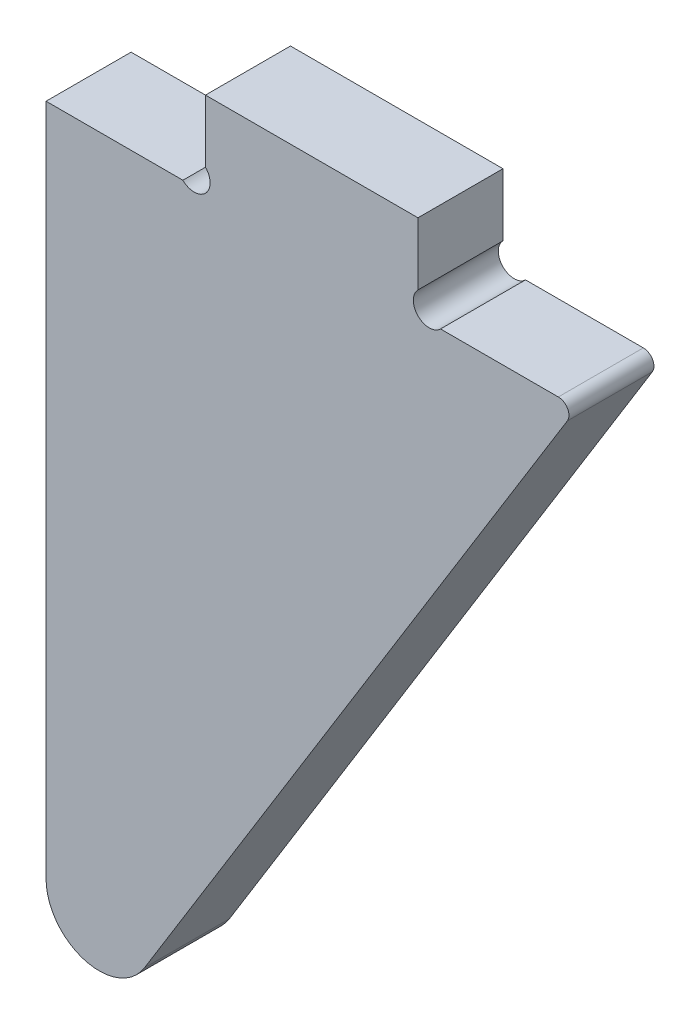
ISO-10303-21;
HEADER;
FILE_DESCRIPTION(('STEP AP214'),'2;1');
FILE_NAME('part.step','',(''),(''),'','','');
FILE_SCHEMA(('AUTOMOTIVE_DESIGN { 1 0 10303 214 1 1 1 1 }'));
ENDSEC;
DATA;
#1=APPLICATION_CONTEXT('core data for automotive mechanical design processes');
#2=APPLICATION_PROTOCOL_DEFINITION('international standard','automotive_design',2000,#1);
#3=PRODUCT_CONTEXT('',#1,'mechanical');
#4=PRODUCT('Part','Part','',(#3));
#5=PRODUCT_RELATED_PRODUCT_CATEGORY('part','',(#4));
#6=PRODUCT_DEFINITION_FORMATION('','',#4);
#7=PRODUCT_DEFINITION_CONTEXT('part definition',#1,'design');
#8=PRODUCT_DEFINITION('design','',#6,#7);
#9=PRODUCT_DEFINITION_SHAPE('','',#8);
#10=(LENGTH_UNIT() NAMED_UNIT(*) SI_UNIT(.MILLI.,.METRE.));
#11=(NAMED_UNIT(*) PLANE_ANGLE_UNIT() SI_UNIT($,.RADIAN.));
#12=(NAMED_UNIT(*) SI_UNIT($,.STERADIAN.) SOLID_ANGLE_UNIT());
#13=UNCERTAINTY_MEASURE_WITH_UNIT(LENGTH_MEASURE(1.E-05),#10,'distance_accuracy_value','');
#14=(GEOMETRIC_REPRESENTATION_CONTEXT(3) GLOBAL_UNCERTAINTY_ASSIGNED_CONTEXT((#13)) GLOBAL_UNIT_ASSIGNED_CONTEXT((#10,
#11,#12)) REPRESENTATION_CONTEXT('',''));
#15=CARTESIAN_POINT('',(0.,0.,0.));
#16=DIRECTION('',(0.,0.,1.));
#17=DIRECTION('',(1.,0.,0.));
#18=AXIS2_PLACEMENT_3D('',#15,#16,#17);
#19=CARTESIAN_POINT('',(50.,81.,8.));
#20=DIRECTION('',(-0.85093611014404,0.525269203792617,0.));
#21=DIRECTION('',(-0.525269203792617,-0.85093611014404,0.));
#22=AXIS2_PLACEMENT_3D('',#19,#20,#21);
#23=PLANE('',#22);
#24=DIRECTION('',(0.525269203792617,0.85093611014404,0.));
#25=VECTOR('',#24,1.);
#26=CARTESIAN_POINT('',(50.,81.,0.));
#27=LINE('',#26,#25);
#28=CARTESIAN_POINT('',(9.2546805507202,14.9925824921667,0.));
#29=VERTEX_POINT('',#28);
#30=CARTESIAN_POINT('',(49.058475800128,79.4747307962074,0.));
#31=VERTEX_POINT('',#30);
#32=EDGE_CURVE('E155',#29,#31,#27,.T.);
#33=ORIENTED_EDGE('',*,*,#32,.T.);
#34=DIRECTION('',(0.,0.,-1.));
#35=VECTOR('',#34,1.);
#36=CARTESIAN_POINT('',(49.058475800128,79.4747307962074,8.));
#37=LINE('',#36,#35);
#38=CARTESIAN_POINT('',(49.058475800128,79.4747307962074,8.));
#39=VERTEX_POINT('',#38);
#40=EDGE_CURVE('E40',#31,#39,#37,.F.);
#41=ORIENTED_EDGE('',*,*,#40,.T.);
#42=DIRECTION('',(0.525269203792617,0.85093611014404,0.));
#43=VECTOR('',#42,1.);
#44=CARTESIAN_POINT('',(50.,81.,8.));
#45=LINE('',#44,#43);
#46=CARTESIAN_POINT('',(9.2546805507202,14.9925824921667,8.));
#47=VERTEX_POINT('',#46);
#48=EDGE_CURVE('E124',#47,#39,#45,.T.);
#49=ORIENTED_EDGE('',*,*,#48,.F.);
#50=DIRECTION('',(0.,0.,-1.));
#51=VECTOR('',#50,1.);
#52=CARTESIAN_POINT('',(9.2546805507202,14.9925824921667,8.));
#53=LINE('',#52,#51);
#54=EDGE_CURVE('E132',#47,#29,#53,.T.);
#55=ORIENTED_EDGE('',*,*,#54,.T.);
#56=EDGE_LOOP('',(#33,#41,#49,#55));
#57=FACE_BOUND('',#56,.T.);
#58=ADVANCED_FACE('F32',(#57),#23,.F.);
#59=CARTESIAN_POINT('',(37.1213203435597,81.,8.));
#60=DIRECTION('',(0.,-1.,0.));
#61=DIRECTION('',(0.,0.,-1.));
#62=AXIS2_PLACEMENT_3D('',#59,#60,#61);
#63=PLANE('',#62);
#64=DIRECTION('',(-1.,0.,0.));
#65=VECTOR('',#64,1.);
#66=CARTESIAN_POINT('',(37.1213203435597,81.,8.));
#67=LINE('',#66,#65);
#68=CARTESIAN_POINT('',(48.207539689984,81.,8.));
#69=VERTEX_POINT('',#68);
#70=CARTESIAN_POINT('',(37.1213203435597,81.,8.));
#71=VERTEX_POINT('',#70);
#72=EDGE_CURVE('E114',#69,#71,#67,.T.);
#73=ORIENTED_EDGE('',*,*,#72,.F.);
#74=DIRECTION('',(0.,0.,-1.));
#75=VECTOR('',#74,1.);
#76=CARTESIAN_POINT('',(48.207539689984,81.,8.));
#77=LINE('',#76,#75);
#78=CARTESIAN_POINT('',(48.207539689984,81.,0.));
#79=VERTEX_POINT('',#78);
#80=EDGE_CURVE('E196',#69,#79,#77,.T.);
#81=ORIENTED_EDGE('',*,*,#80,.T.);
#82=DIRECTION('',(-1.,0.,0.));
#83=VECTOR('',#82,1.);
#84=CARTESIAN_POINT('',(37.1213203435597,81.,0.));
#85=LINE('',#84,#83);
#86=CARTESIAN_POINT('',(37.1213203435597,81.,0.));
#87=VERTEX_POINT('',#86);
#88=EDGE_CURVE('E129',#79,#87,#85,.T.);
#89=ORIENTED_EDGE('',*,*,#88,.T.);
#90=DIRECTION('',(0.,0.,-1.));
#91=VECTOR('',#90,1.);
#92=CARTESIAN_POINT('',(37.1213203435597,81.,8.));
#93=LINE('',#92,#91);
#94=EDGE_CURVE('E127',#71,#87,#93,.T.);
#95=ORIENTED_EDGE('',*,*,#94,.F.);
#96=EDGE_LOOP('',(#73,#81,#89,#95));
#97=FACE_BOUND('',#96,.T.);
#98=ADVANCED_FACE('F128',(#97),#63,.F.);
#99=CARTESIAN_POINT('',(36.0606601717798,82.0606601717798,8.));
#100=DIRECTION('',(0.,0.,-1.));
#101=DIRECTION('',(-1.,0.,0.));
#102=AXIS2_PLACEMENT_3D('',#99,#100,#101);
#103=CYLINDRICAL_SURFACE('',#102,1.5);
#104=CARTESIAN_POINT('',(36.0606601717798,82.0606601717798,0.));
#105=DIRECTION('',(0.,0.,-1.));
#106=DIRECTION('',(1.,0.,0.));
#107=AXIS2_PLACEMENT_3D('',#104,#105,#106);
#108=CIRCLE('',#107,1.5);
#109=CARTESIAN_POINT('',(35.,83.1213203435596,0.));
#110=VERTEX_POINT('',#109);
#111=EDGE_CURVE('E158',#87,#110,#108,.T.);
#112=ORIENTED_EDGE('',*,*,#111,.T.);
#113=DIRECTION('',(0.,0.,-1.));
#114=VECTOR('',#113,1.);
#115=CARTESIAN_POINT('',(35.,83.1213203435596,8.));
#116=LINE('',#115,#114);
#117=CARTESIAN_POINT('',(35.,83.1213203435596,8.));
#118=VERTEX_POINT('',#117);
#119=EDGE_CURVE('E133',#118,#110,#116,.T.);
#120=ORIENTED_EDGE('',*,*,#119,.F.);
#121=CARTESIAN_POINT('',(36.0606601717798,82.0606601717798,8.));
#122=DIRECTION('',(0.,0.,-1.));
#123=DIRECTION('',(1.,0.,0.));
#124=AXIS2_PLACEMENT_3D('',#121,#122,#123);
#125=CIRCLE('',#124,1.5);
#126=EDGE_CURVE('E118',#71,#118,#125,.T.);
#127=ORIENTED_EDGE('',*,*,#126,.F.);
#128=ORIENTED_EDGE('',*,*,#94,.T.);
#129=EDGE_LOOP('',(#112,#120,#127,#128));
#130=FACE_BOUND('',#129,.T.);
#131=ADVANCED_FACE('F135',(#130),#103,.F.);
#132=CARTESIAN_POINT('',(35.,89.,8.));
#133=DIRECTION('',(-1.,0.,0.));
#134=DIRECTION('',(0.,0.,1.));
#135=AXIS2_PLACEMENT_3D('',#132,#133,#134);
#136=PLANE('',#135);
#137=DIRECTION('',(0.,1.,0.));
#138=VECTOR('',#137,1.);
#139=CARTESIAN_POINT('',(35.,89.,0.));
#140=LINE('',#139,#138);
#141=CARTESIAN_POINT('',(35.,89.,0.));
#142=VERTEX_POINT('',#141);
#143=EDGE_CURVE('E160',#110,#142,#140,.T.);
#144=ORIENTED_EDGE('',*,*,#143,.T.);
#145=DIRECTION('',(0.,0.,-1.));
#146=VECTOR('',#145,1.);
#147=CARTESIAN_POINT('',(35.,89.,8.));
#148=LINE('',#147,#146);
#149=CARTESIAN_POINT('',(35.,89.,8.));
#150=VERTEX_POINT('',#149);
#151=EDGE_CURVE('E184',#150,#142,#148,.T.);
#152=ORIENTED_EDGE('',*,*,#151,.F.);
#153=DIRECTION('',(0.,1.,0.));
#154=VECTOR('',#153,1.);
#155=CARTESIAN_POINT('',(35.,89.,8.));
#156=LINE('',#155,#154);
#157=EDGE_CURVE('E138',#118,#150,#156,.T.);
#158=ORIENTED_EDGE('',*,*,#157,.F.);
#159=ORIENTED_EDGE('',*,*,#119,.T.);
#160=EDGE_LOOP('',(#144,#152,#158,#159));
#161=FACE_BOUND('',#160,.T.);
#162=ADVANCED_FACE('F203',(#161),#136,.F.);
#163=CARTESIAN_POINT('',(15.,89.,8.));
#164=DIRECTION('',(0.,-1.,0.));
#165=DIRECTION('',(0.,0.,-1.));
#166=AXIS2_PLACEMENT_3D('',#163,#164,#165);
#167=PLANE('',#166);
#168=DIRECTION('',(-1.,0.,0.));
#169=VECTOR('',#168,1.);
#170=CARTESIAN_POINT('',(15.,89.,0.));
#171=LINE('',#170,#169);
#172=CARTESIAN_POINT('',(15.,89.,0.));
#173=VERTEX_POINT('',#172);
#174=EDGE_CURVE('E162',#142,#173,#171,.T.);
#175=ORIENTED_EDGE('',*,*,#174,.T.);
#176=DIRECTION('',(0.,0.,-1.));
#177=VECTOR('',#176,1.);
#178=CARTESIAN_POINT('',(15.,89.,8.));
#179=LINE('',#178,#177);
#180=CARTESIAN_POINT('',(15.,89.,8.));
#181=VERTEX_POINT('',#180);
#182=EDGE_CURVE('E181',#181,#173,#179,.T.);
#183=ORIENTED_EDGE('',*,*,#182,.F.);
#184=DIRECTION('',(-1.,0.,0.));
#185=VECTOR('',#184,1.);
#186=CARTESIAN_POINT('',(15.,89.,8.));
#187=LINE('',#186,#185);
#188=EDGE_CURVE('E140',#150,#181,#187,.T.);
#189=ORIENTED_EDGE('',*,*,#188,.F.);
#190=ORIENTED_EDGE('',*,*,#151,.T.);
#191=EDGE_LOOP('',(#175,#183,#189,#190));
#192=FACE_BOUND('',#191,.T.);
#193=ADVANCED_FACE('F210',(#192),#167,.F.);
#194=CARTESIAN_POINT('',(15.,83.1213203435596,8.));
#195=DIRECTION('',(1.,0.,0.));
#196=DIRECTION('',(0.,0.,-1.));
#197=AXIS2_PLACEMENT_3D('',#194,#195,#196);
#198=PLANE('',#197);
#199=DIRECTION('',(0.,-1.,0.));
#200=VECTOR('',#199,1.);
#201=CARTESIAN_POINT('',(15.,83.1213203435596,0.));
#202=LINE('',#201,#200);
#203=CARTESIAN_POINT('',(15.,83.1213203435596,0.));
#204=VERTEX_POINT('',#203);
#205=EDGE_CURVE('E164',#173,#204,#202,.T.);
#206=ORIENTED_EDGE('',*,*,#205,.T.);
#207=DIRECTION('',(0.,0.,-1.));
#208=VECTOR('',#207,1.);
#209=CARTESIAN_POINT('',(15.,83.1213203435596,8.));
#210=LINE('',#209,#208);
#211=CARTESIAN_POINT('',(15.,83.1213203435596,8.));
#212=VERTEX_POINT('',#211);
#213=EDGE_CURVE('E178',#212,#204,#210,.T.);
#214=ORIENTED_EDGE('',*,*,#213,.F.);
#215=DIRECTION('',(0.,-1.,0.));
#216=VECTOR('',#215,1.);
#217=CARTESIAN_POINT('',(15.,83.1213203435596,8.));
#218=LINE('',#217,#216);
#219=EDGE_CURVE('E145',#181,#212,#218,.T.);
#220=ORIENTED_EDGE('',*,*,#219,.F.);
#221=ORIENTED_EDGE('',*,*,#182,.T.);
#222=EDGE_LOOP('',(#206,#214,#220,#221));
#223=FACE_BOUND('',#222,.T.);
#224=ADVANCED_FACE('F213',(#223),#198,.F.);
#225=CARTESIAN_POINT('',(13.9393398282202,82.0606601717798,8.));
#226=DIRECTION('',(0.,0.,-1.));
#227=DIRECTION('',(-1.,0.,0.));
#228=AXIS2_PLACEMENT_3D('',#225,#226,#227);
#229=CYLINDRICAL_SURFACE('',#228,1.5);
#230=CARTESIAN_POINT('',(13.9393398282202,82.0606601717798,0.));
#231=DIRECTION('',(0.,0.,-1.));
#232=DIRECTION('',(1.,0.,0.));
#233=AXIS2_PLACEMENT_3D('',#230,#231,#232);
#234=CIRCLE('',#233,1.5);
#235=CARTESIAN_POINT('',(12.8786796564404,81.,0.));
#236=VERTEX_POINT('',#235);
#237=EDGE_CURVE('E166',#204,#236,#234,.T.);
#238=ORIENTED_EDGE('',*,*,#237,.T.);
#239=DIRECTION('',(0.,0.,-1.));
#240=VECTOR('',#239,1.);
#241=CARTESIAN_POINT('',(12.8786796564404,81.,8.));
#242=LINE('',#241,#240);
#243=CARTESIAN_POINT('',(12.8786796564404,81.,8.));
#244=VERTEX_POINT('',#243);
#245=EDGE_CURVE('E175',#244,#236,#242,.T.);
#246=ORIENTED_EDGE('',*,*,#245,.F.);
#247=CARTESIAN_POINT('',(13.9393398282202,82.0606601717798,8.));
#248=DIRECTION('',(0.,0.,-1.));
#249=DIRECTION('',(1.,0.,0.));
#250=AXIS2_PLACEMENT_3D('',#247,#248,#249);
#251=CIRCLE('',#250,1.5);
#252=EDGE_CURVE('E147',#212,#244,#251,.T.);
#253=ORIENTED_EDGE('',*,*,#252,.F.);
#254=ORIENTED_EDGE('',*,*,#213,.T.);
#255=EDGE_LOOP('',(#238,#246,#253,#254));
#256=FACE_BOUND('',#255,.T.);
#257=ADVANCED_FACE('F218',(#256),#229,.F.);
#258=CARTESIAN_POINT('',(0.,81.,8.));
#259=DIRECTION('',(0.,-1.,0.));
#260=DIRECTION('',(0.,0.,-1.));
#261=AXIS2_PLACEMENT_3D('',#258,#259,#260);
#262=PLANE('',#261);
#263=DIRECTION('',(-1.,0.,0.));
#264=VECTOR('',#263,1.);
#265=CARTESIAN_POINT('',(0.,81.,0.));
#266=LINE('',#265,#264);
#267=CARTESIAN_POINT('',(0.,81.,0.));
#268=VERTEX_POINT('',#267);
#269=EDGE_CURVE('E168',#236,#268,#266,.T.);
#270=ORIENTED_EDGE('',*,*,#269,.T.);
#271=DIRECTION('',(0.,0.,-1.));
#272=VECTOR('',#271,1.);
#273=CARTESIAN_POINT('',(0.,81.,8.));
#274=LINE('',#273,#272);
#275=CARTESIAN_POINT('',(0.,81.,8.));
#276=VERTEX_POINT('',#275);
#277=EDGE_CURVE('E154',#276,#268,#274,.T.);
#278=ORIENTED_EDGE('',*,*,#277,.F.);
#279=DIRECTION('',(-1.,0.,0.));
#280=VECTOR('',#279,1.);
#281=CARTESIAN_POINT('',(0.,81.,8.));
#282=LINE('',#281,#280);
#283=EDGE_CURVE('E149',#244,#276,#282,.T.);
#284=ORIENTED_EDGE('',*,*,#283,.F.);
#285=ORIENTED_EDGE('',*,*,#245,.T.);
#286=EDGE_LOOP('',(#270,#278,#284,#285));
#287=FACE_BOUND('',#286,.T.);
#288=ADVANCED_FACE('F224',(#287),#262,.F.);
#289=CARTESIAN_POINT('',(0.,0.,8.));
#290=DIRECTION('',(1.,0.,0.));
#291=DIRECTION('',(0.,0.,-1.));
#292=AXIS2_PLACEMENT_3D('',#289,#290,#291);
#293=PLANE('',#292);
#294=DIRECTION('',(0.,-1.,0.));
#295=VECTOR('',#294,1.);
#296=CARTESIAN_POINT('',(0.,0.,0.));
#297=LINE('',#296,#295);
#298=CARTESIAN_POINT('',(0.,17.6189285111298,0.));
#299=VERTEX_POINT('',#298);
#300=EDGE_CURVE('E170',#268,#299,#297,.T.);
#301=ORIENTED_EDGE('',*,*,#300,.T.);
#302=DIRECTION('',(0.,0.,-1.));
#303=VECTOR('',#302,1.);
#304=CARTESIAN_POINT('',(0.,17.6189285111298,8.));
#305=LINE('',#304,#303);
#306=CARTESIAN_POINT('',(0.,17.6189285111298,8.));
#307=VERTEX_POINT('',#306);
#308=EDGE_CURVE('E192',#299,#307,#305,.F.);
#309=ORIENTED_EDGE('',*,*,#308,.T.);
#310=DIRECTION('',(0.,-1.,0.));
#311=VECTOR('',#310,1.);
#312=CARTESIAN_POINT('',(0.,0.,8.));
#313=LINE('',#312,#311);
#314=EDGE_CURVE('E151',#276,#307,#313,.T.);
#315=ORIENTED_EDGE('',*,*,#314,.F.);
#316=ORIENTED_EDGE('',*,*,#277,.T.);
#317=EDGE_LOOP('',(#301,#309,#315,#316));
#318=FACE_BOUND('',#317,.T.);
#319=ADVANCED_FACE('F228',(#318),#293,.F.);
#320=CARTESIAN_POINT('',(13.9393398282202,82.0606601717798,8.));
#321=DIRECTION('',(0.,0.,1.));
#322=DIRECTION('',(1.,0.,0.));
#323=AXIS2_PLACEMENT_3D('',#320,#321,#322);
#324=PLANE('',#323);
#325=ORIENTED_EDGE('',*,*,#48,.T.);
#326=CARTESIAN_POINT('',(48.207539689984,80.,8.));
#327=DIRECTION('',(0.,0.,1.));
#328=DIRECTION('',(1.,0.,0.));
#329=AXIS2_PLACEMENT_3D('',#326,#327,#328);
#330=CIRCLE('',#329,1.);
#331=EDGE_CURVE('E11',#39,#69,#330,.T.);
#332=ORIENTED_EDGE('',*,*,#331,.T.);
#333=ORIENTED_EDGE('',*,*,#72,.T.);
#334=ORIENTED_EDGE('',*,*,#126,.T.);
#335=ORIENTED_EDGE('',*,*,#157,.T.);
#336=ORIENTED_EDGE('',*,*,#188,.T.);
#337=ORIENTED_EDGE('',*,*,#219,.T.);
#338=ORIENTED_EDGE('',*,*,#252,.T.);
#339=ORIENTED_EDGE('',*,*,#283,.T.);
#340=ORIENTED_EDGE('',*,*,#314,.T.);
#341=CARTESIAN_POINT('',(5.,17.6189285111298,8.));
#342=DIRECTION('',(0.,0.,1.));
#343=DIRECTION('',(1.,0.,0.));
#344=AXIS2_PLACEMENT_3D('',#341,#342,#343);
#345=CIRCLE('',#344,5.);
#346=EDGE_CURVE('E194',#307,#47,#345,.T.);
#347=ORIENTED_EDGE('',*,*,#346,.T.);
#348=EDGE_LOOP('',(#325,#332,#333,#334,#335,#336,#337,#338,#339,#340,#347));
#349=FACE_BOUND('',#348,.T.);
#350=ADVANCED_FACE('F116',(#349),#324,.T.);
#351=CARTESIAN_POINT('',(13.9393398282202,82.0606601717798,0.));
#352=DIRECTION('',(0.,0.,1.));
#353=DIRECTION('',(1.,0.,0.));
#354=AXIS2_PLACEMENT_3D('',#351,#352,#353);
#355=PLANE('',#354);
#356=ORIENTED_EDGE('',*,*,#88,.F.);
#357=CARTESIAN_POINT('',(48.207539689984,80.,0.));
#358=DIRECTION('',(0.,0.,1.));
#359=DIRECTION('',(1.,0.,0.));
#360=AXIS2_PLACEMENT_3D('',#357,#358,#359);
#361=CIRCLE('',#360,1.);
#362=EDGE_CURVE('E54',#79,#31,#361,.F.);
#363=ORIENTED_EDGE('',*,*,#362,.T.);
#364=ORIENTED_EDGE('',*,*,#32,.F.);
#365=CARTESIAN_POINT('',(5.,17.6189285111298,0.));
#366=DIRECTION('',(0.,0.,1.));
#367=DIRECTION('',(1.,0.,0.));
#368=AXIS2_PLACEMENT_3D('',#365,#366,#367);
#369=CIRCLE('',#368,5.);
#370=EDGE_CURVE('E190',#29,#299,#369,.F.);
#371=ORIENTED_EDGE('',*,*,#370,.T.);
#372=ORIENTED_EDGE('',*,*,#300,.F.);
#373=ORIENTED_EDGE('',*,*,#269,.F.);
#374=ORIENTED_EDGE('',*,*,#237,.F.);
#375=ORIENTED_EDGE('',*,*,#205,.F.);
#376=ORIENTED_EDGE('',*,*,#174,.F.);
#377=ORIENTED_EDGE('',*,*,#143,.F.);
#378=ORIENTED_EDGE('',*,*,#111,.F.);
#379=EDGE_LOOP('',(#356,#363,#364,#371,#372,#373,#374,#375,#376,#377,#378));
#380=FACE_BOUND('',#379,.T.);
#381=ADVANCED_FACE('F199',(#380),#355,.F.);
#382=CARTESIAN_POINT('',(5.,17.6189285111298,8.));
#383=DIRECTION('',(0.,0.,-1.));
#384=DIRECTION('',(-1.,0.,0.));
#385=AXIS2_PLACEMENT_3D('',#382,#383,#384);
#386=CYLINDRICAL_SURFACE('',#385,5.);
#387=ORIENTED_EDGE('',*,*,#346,.F.);
#388=ORIENTED_EDGE('',*,*,#308,.F.);
#389=ORIENTED_EDGE('',*,*,#370,.F.);
#390=ORIENTED_EDGE('',*,*,#54,.F.);
#391=EDGE_LOOP('',(#387,#388,#389,#390));
#392=FACE_BOUND('',#391,.T.);
#393=ADVANCED_FACE('F231',(#392),#386,.T.);
#394=CARTESIAN_POINT('',(48.207539689984,80.,8.));
#395=DIRECTION('',(0.,0.,-1.));
#396=DIRECTION('',(-1.,0.,0.));
#397=AXIS2_PLACEMENT_3D('',#394,#395,#396);
#398=CYLINDRICAL_SURFACE('',#397,1.);
#399=ORIENTED_EDGE('',*,*,#331,.F.);
#400=ORIENTED_EDGE('',*,*,#40,.F.);
#401=ORIENTED_EDGE('',*,*,#362,.F.);
#402=ORIENTED_EDGE('',*,*,#80,.F.);
#403=EDGE_LOOP('',(#399,#400,#401,#402));
#404=FACE_BOUND('',#403,.T.);
#405=ADVANCED_FACE('F34',(#404),#398,.T.);
#406=CLOSED_SHELL('',(#58,#98,#131,#162,#193,#224,#257,#288,#319,#350,#381,#393,#405));
#407=MANIFOLD_SOLID_BREP('B2',#406);
#408=ADVANCED_BREP_SHAPE_REPRESENTATION('',(#18,#407),#14);
#409=SHAPE_DEFINITION_REPRESENTATION(#9,#408);
ENDSEC;
END-ISO-10303-21;
